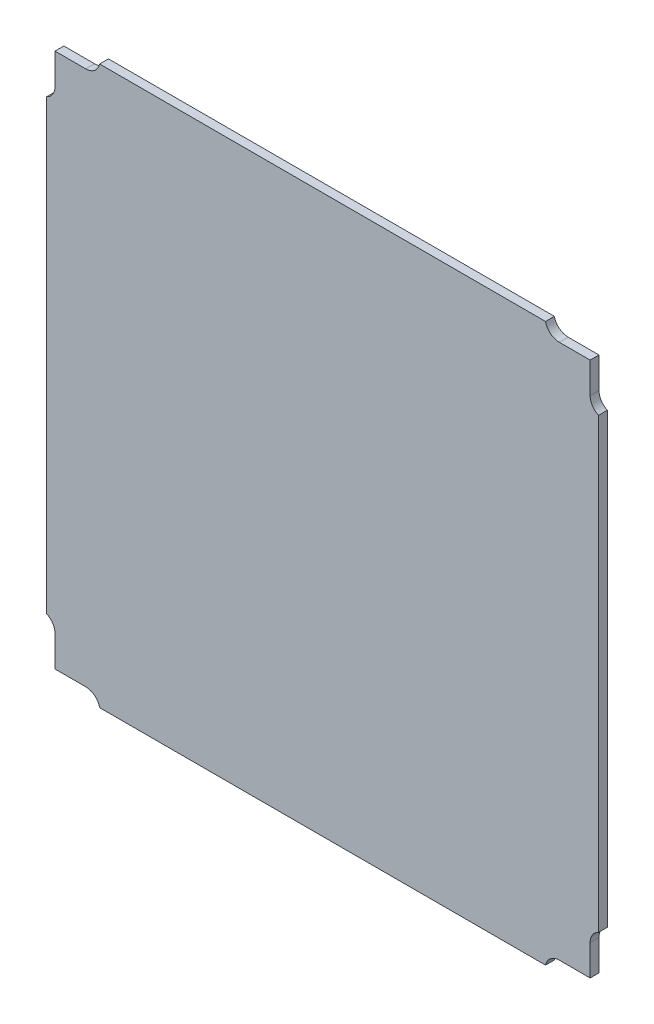
ISO-10303-21;
HEADER;
FILE_DESCRIPTION(('STEP AP214'),'2;1');
FILE_NAME('part.step','',(''),(''),'','','');
FILE_SCHEMA(('AUTOMOTIVE_DESIGN { 1 0 10303 214 1 1 1 1 }'));
ENDSEC;
DATA;
#1=APPLICATION_CONTEXT('core data for automotive mechanical design processes');
#2=APPLICATION_PROTOCOL_DEFINITION('international standard','automotive_design',2000,#1);
#3=PRODUCT_CONTEXT('',#1,'mechanical');
#4=PRODUCT('Part','Part','',(#3));
#5=PRODUCT_RELATED_PRODUCT_CATEGORY('part','',(#4));
#6=PRODUCT_DEFINITION_FORMATION('','',#4);
#7=PRODUCT_DEFINITION_CONTEXT('part definition',#1,'design');
#8=PRODUCT_DEFINITION('design','',#6,#7);
#9=PRODUCT_DEFINITION_SHAPE('','',#8);
#10=(LENGTH_UNIT() NAMED_UNIT(*) SI_UNIT(.MILLI.,.METRE.));
#11=(NAMED_UNIT(*) PLANE_ANGLE_UNIT() SI_UNIT($,.RADIAN.));
#12=(NAMED_UNIT(*) SI_UNIT($,.STERADIAN.) SOLID_ANGLE_UNIT());
#13=UNCERTAINTY_MEASURE_WITH_UNIT(LENGTH_MEASURE(1.E-05),#10,'distance_accuracy_value','');
#14=(GEOMETRIC_REPRESENTATION_CONTEXT(3) GLOBAL_UNCERTAINTY_ASSIGNED_CONTEXT((#13)) GLOBAL_UNIT_ASSIGNED_CONTEXT((#10,
#11,#12)) REPRESENTATION_CONTEXT('',''));
#15=CARTESIAN_POINT('',(0.,0.,0.));
#16=DIRECTION('',(0.,0.,1.));
#17=DIRECTION('',(1.,0.,0.));
#18=AXIS2_PLACEMENT_3D('',#15,#16,#17);
#19=CARTESIAN_POINT('',(0.,0.,1.5875));
#20=DIRECTION('',(0.,0.,1.));
#21=DIRECTION('',(1.,0.,0.));
#22=AXIS2_PLACEMENT_3D('',#19,#20,#21);
#23=PLANE('',#22);
#24=CARTESIAN_POINT('',(-50.54,42.4819347291982,1.5875));
#25=DIRECTION('',(0.,0.,1.));
#26=DIRECTION('',(1.,0.,0.));
#27=AXIS2_PLACEMENT_3D('',#24,#25,#26);
#28=CIRCLE('',#27,2.54);
#29=CARTESIAN_POINT('',(-48.,42.4819347291981,1.5875));
#30=VERTEX_POINT('',#29);
#31=CARTESIAN_POINT('',(-49.5,40.1646086839469,1.5875));
#32=VERTEX_POINT('',#31);
#33=EDGE_CURVE('E207',#30,#32,#28,.F.);
#34=ORIENTED_EDGE('',*,*,#33,.T.);
#35=DIRECTION('',(0.,-1.,0.));
#36=VECTOR('',#35,1.);
#37=CARTESIAN_POINT('',(-49.5,50.,1.5875));
#38=LINE('',#37,#36);
#39=CARTESIAN_POINT('',(-49.5,-40.1646086839469,1.5875));
#40=VERTEX_POINT('',#39);
#41=EDGE_CURVE('E71',#32,#40,#38,.T.);
#42=ORIENTED_EDGE('',*,*,#41,.T.);
#43=CARTESIAN_POINT('',(-50.54,-42.4819347291982,1.5875));
#44=DIRECTION('',(0.,0.,1.));
#45=DIRECTION('',(1.,0.,0.));
#46=AXIS2_PLACEMENT_3D('',#43,#44,#45);
#47=CIRCLE('',#46,2.54);
#48=CARTESIAN_POINT('',(-48.,-42.4819347291982,1.5875));
#49=VERTEX_POINT('',#48);
#50=EDGE_CURVE('E203',#40,#49,#47,.F.);
#51=ORIENTED_EDGE('',*,*,#50,.T.);
#52=DIRECTION('',(0.,-1.,0.));
#53=VECTOR('',#52,1.);
#54=CARTESIAN_POINT('',(-47.9999999999999,0.,1.5875));
#55=LINE('',#54,#53);
#56=CARTESIAN_POINT('',(-48.,-48.,1.5875));
#57=VERTEX_POINT('',#56);
#58=EDGE_CURVE('E301',#49,#57,#55,.T.);
#59=ORIENTED_EDGE('',*,*,#58,.T.);
#60=DIRECTION('',(1.,0.,0.));
#61=VECTOR('',#60,1.);
#62=CARTESIAN_POINT('',(0.,-48.0000000000001,1.5875));
#63=LINE('',#62,#61);
#64=CARTESIAN_POINT('',(-42.4819347291981,-48.,1.5875));
#65=VERTEX_POINT('',#64);
#66=EDGE_CURVE('E312',#57,#65,#63,.T.);
#67=ORIENTED_EDGE('',*,*,#66,.T.);
#68=CARTESIAN_POINT('',(-42.4819347291981,-50.54,1.5875));
#69=DIRECTION('',(0.,0.,1.));
#70=DIRECTION('',(1.,0.,0.));
#71=AXIS2_PLACEMENT_3D('',#68,#69,#70);
#72=CIRCLE('',#71,2.54);
#73=CARTESIAN_POINT('',(-40.,-50.,1.5875));
#74=VERTEX_POINT('',#73);
#75=EDGE_CURVE('E219',#65,#74,#72,.F.);
#76=ORIENTED_EDGE('',*,*,#75,.T.);
#77=DIRECTION('',(1.,0.,0.));
#78=VECTOR('',#77,1.);
#79=CARTESIAN_POINT('',(0.,-50.,1.5875));
#80=LINE('',#79,#78);
#81=CARTESIAN_POINT('',(40.,-50.,1.5875));
#82=VERTEX_POINT('',#81);
#83=EDGE_CURVE('E315',#74,#82,#80,.T.);
#84=ORIENTED_EDGE('',*,*,#83,.T.);
#85=CARTESIAN_POINT('',(42.4819347291982,-50.54,1.5875));
#86=DIRECTION('',(0.,0.,1.));
#87=DIRECTION('',(1.,0.,0.));
#88=AXIS2_PLACEMENT_3D('',#85,#86,#87);
#89=CIRCLE('',#88,2.54);
#90=CARTESIAN_POINT('',(42.4819347291982,-48.,1.5875));
#91=VERTEX_POINT('',#90);
#92=EDGE_CURVE('E229',#82,#91,#89,.F.);
#93=ORIENTED_EDGE('',*,*,#92,.T.);
#94=DIRECTION('',(1.,0.,0.));
#95=VECTOR('',#94,1.);
#96=CARTESIAN_POINT('',(-1.2490009027033E-13,-47.9999999999999,1.5875));
#97=LINE('',#96,#95);
#98=CARTESIAN_POINT('',(48.,-48.,1.5875));
#99=VERTEX_POINT('',#98);
#100=EDGE_CURVE('E319',#91,#99,#97,.T.);
#101=ORIENTED_EDGE('',*,*,#100,.T.);
#102=DIRECTION('',(0.,1.,0.));
#103=VECTOR('',#102,1.);
#104=CARTESIAN_POINT('',(48.0000000000001,0.,1.5875));
#105=LINE('',#104,#103);
#106=CARTESIAN_POINT('',(48.,-42.4819347291982,1.5875));
#107=VERTEX_POINT('',#106);
#108=EDGE_CURVE('E321',#99,#107,#105,.T.);
#109=ORIENTED_EDGE('',*,*,#108,.T.);
#110=CARTESIAN_POINT('',(50.54,-42.4819347291982,1.5875));
#111=DIRECTION('',(0.,0.,1.));
#112=DIRECTION('',(1.,0.,0.));
#113=AXIS2_PLACEMENT_3D('',#110,#111,#112);
#114=CIRCLE('',#113,2.54);
#115=CARTESIAN_POINT('',(49.5,-40.1646086839469,1.5875));
#116=VERTEX_POINT('',#115);
#117=EDGE_CURVE('E233',#107,#116,#114,.F.);
#118=ORIENTED_EDGE('',*,*,#117,.T.);
#119=DIRECTION('',(0.,1.,0.));
#120=VECTOR('',#119,1.);
#121=CARTESIAN_POINT('',(49.5,50.,1.5875));
#122=LINE('',#121,#120);
#123=CARTESIAN_POINT('',(49.5,40.1646086839469,1.5875));
#124=VERTEX_POINT('',#123);
#125=EDGE_CURVE('E208',#116,#124,#122,.T.);
#126=ORIENTED_EDGE('',*,*,#125,.T.);
#127=CARTESIAN_POINT('',(50.54,42.4819347291981,1.5875));
#128=DIRECTION('',(0.,0.,1.));
#129=DIRECTION('',(1.,0.,0.));
#130=AXIS2_PLACEMENT_3D('',#127,#128,#129);
#131=CIRCLE('',#130,2.54);
#132=CARTESIAN_POINT('',(48.,42.4819347291982,1.5875));
#133=VERTEX_POINT('',#132);
#134=EDGE_CURVE('E240',#124,#133,#131,.F.);
#135=ORIENTED_EDGE('',*,*,#134,.T.);
#136=DIRECTION('',(0.,1.,0.));
#137=VECTOR('',#136,1.);
#138=CARTESIAN_POINT('',(47.9999999999999,-1.2490009027033E-13,1.5875));
#139=LINE('',#138,#137);
#140=CARTESIAN_POINT('',(48.,48.,1.5875));
#141=VERTEX_POINT('',#140);
#142=EDGE_CURVE('E323',#133,#141,#139,.T.);
#143=ORIENTED_EDGE('',*,*,#142,.T.);
#144=DIRECTION('',(-1.,0.,0.));
#145=VECTOR('',#144,1.);
#146=CARTESIAN_POINT('',(1.2490009027033E-13,48.0000000000001,1.5875));
#147=LINE('',#146,#145);
#148=CARTESIAN_POINT('',(42.4819347291982,48.,1.5875));
#149=VERTEX_POINT('',#148);
#150=EDGE_CURVE('E326',#141,#149,#147,.T.);
#151=ORIENTED_EDGE('',*,*,#150,.T.);
#152=CARTESIAN_POINT('',(42.4819347291982,50.54,1.5875));
#153=DIRECTION('',(0.,0.,1.));
#154=DIRECTION('',(1.,0.,0.));
#155=AXIS2_PLACEMENT_3D('',#152,#153,#154);
#156=CIRCLE('',#155,2.54);
#157=CARTESIAN_POINT('',(40.,50.,1.5875));
#158=VERTEX_POINT('',#157);
#159=EDGE_CURVE('E246',#149,#158,#156,.F.);
#160=ORIENTED_EDGE('',*,*,#159,.T.);
#161=DIRECTION('',(1.,0.,0.));
#162=VECTOR('',#161,1.);
#163=CARTESIAN_POINT('',(0.,50.,1.5875));
#164=LINE('',#163,#162);
#165=CARTESIAN_POINT('',(-40.,50.,1.5875));
#166=VERTEX_POINT('',#165);
#167=EDGE_CURVE('E330',#166,#158,#164,.T.);
#168=ORIENTED_EDGE('',*,*,#167,.F.);
#169=CARTESIAN_POINT('',(-42.4819347291982,50.54,1.5875));
#170=DIRECTION('',(0.,0.,1.));
#171=DIRECTION('',(1.,0.,0.));
#172=AXIS2_PLACEMENT_3D('',#169,#170,#171);
#173=CIRCLE('',#172,2.54);
#174=CARTESIAN_POINT('',(-42.4819347291982,48.,1.5875));
#175=VERTEX_POINT('',#174);
#176=EDGE_CURVE('E251',#166,#175,#173,.F.);
#177=ORIENTED_EDGE('',*,*,#176,.T.);
#178=DIRECTION('',(-1.,0.,0.));
#179=VECTOR('',#178,1.);
#180=CARTESIAN_POINT('',(0.,47.9999999999999,1.5875));
#181=LINE('',#180,#179);
#182=CARTESIAN_POINT('',(-48.,48.,1.5875));
#183=VERTEX_POINT('',#182);
#184=EDGE_CURVE('E299',#175,#183,#181,.T.);
#185=ORIENTED_EDGE('',*,*,#184,.T.);
#186=DIRECTION('',(0.,-1.,0.));
#187=VECTOR('',#186,1.);
#188=CARTESIAN_POINT('',(-48.0000000000001,0.,1.5875));
#189=LINE('',#188,#187);
#190=EDGE_CURVE('E293',#183,#30,#189,.T.);
#191=ORIENTED_EDGE('',*,*,#190,.T.);
#192=EDGE_LOOP('',(#34,#42,#51,#59,#67,#76,#84,#93,#101,#109,#118,#126,#135,#143,#151,#160,#168,
#177,#185,#191));
#193=FACE_BOUND('',#192,.T.);
#194=ADVANCED_FACE('F44',(#193),#23,.T.);
#195=CARTESIAN_POINT('',(0.,0.,0.));
#196=DIRECTION('',(0.,0.,1.));
#197=DIRECTION('',(1.,0.,0.));
#198=AXIS2_PLACEMENT_3D('',#195,#196,#197);
#199=PLANE('',#198);
#200=CARTESIAN_POINT('',(0.,0.,0.));
#201=DIRECTION('',(0.,0.,1.));
#202=DIRECTION('',(1.,0.,0.));
#203=AXIS2_PLACEMENT_3D('',#200,#201,#202);
#204=CIRCLE('',#203,38.5);
#205=CARTESIAN_POINT('',(38.5,0.,0.));
#206=VERTEX_POINT('',#205);
#207=EDGE_CURVE('E12',#206,#206,#204,.F.);
#208=ORIENTED_EDGE('',*,*,#207,.F.);
#209=EDGE_LOOP('',(#208));
#210=FACE_BOUND('',#209,.T.);
#211=DIRECTION('',(0.,-1.,0.));
#212=VECTOR('',#211,1.);
#213=CARTESIAN_POINT('',(-49.5,50.,0.));
#214=LINE('',#213,#212);
#215=CARTESIAN_POINT('',(-49.5,40.1646086839469,0.));
#216=VERTEX_POINT('',#215);
#217=CARTESIAN_POINT('',(-49.5,-40.1646086839469,0.));
#218=VERTEX_POINT('',#217);
#219=EDGE_CURVE('E195',#216,#218,#214,.T.);
#220=ORIENTED_EDGE('',*,*,#219,.F.);
#221=CARTESIAN_POINT('',(-50.54,42.4819347291982,0.));
#222=DIRECTION('',(0.,0.,1.));
#223=DIRECTION('',(1.,0.,0.));
#224=AXIS2_PLACEMENT_3D('',#221,#222,#223);
#225=CIRCLE('',#224,2.54);
#226=CARTESIAN_POINT('',(-48.,42.4819347291981,0.));
#227=VERTEX_POINT('',#226);
#228=EDGE_CURVE('E253',#216,#227,#225,.T.);
#229=ORIENTED_EDGE('',*,*,#228,.T.);
#230=DIRECTION('',(0.,-1.,0.));
#231=VECTOR('',#230,1.);
#232=CARTESIAN_POINT('',(-48.0000000000001,0.,0.));
#233=LINE('',#232,#231);
#234=CARTESIAN_POINT('',(-48.,48.,0.));
#235=VERTEX_POINT('',#234);
#236=EDGE_CURVE('E295',#235,#227,#233,.T.);
#237=ORIENTED_EDGE('',*,*,#236,.F.);
#238=DIRECTION('',(-1.,0.,0.));
#239=VECTOR('',#238,1.);
#240=CARTESIAN_POINT('',(0.,47.9999999999999,0.));
#241=LINE('',#240,#239);
#242=CARTESIAN_POINT('',(-42.4819347291982,48.,0.));
#243=VERTEX_POINT('',#242);
#244=EDGE_CURVE('E359',#243,#235,#241,.T.);
#245=ORIENTED_EDGE('',*,*,#244,.F.);
#246=CARTESIAN_POINT('',(-42.4819347291982,50.54,0.));
#247=DIRECTION('',(0.,0.,1.));
#248=DIRECTION('',(1.,0.,0.));
#249=AXIS2_PLACEMENT_3D('',#246,#247,#248);
#250=CIRCLE('',#249,2.54);
#251=CARTESIAN_POINT('',(-40.,50.,0.));
#252=VERTEX_POINT('',#251);
#253=EDGE_CURVE('E249',#243,#252,#250,.T.);
#254=ORIENTED_EDGE('',*,*,#253,.T.);
#255=DIRECTION('',(1.,0.,0.));
#256=VECTOR('',#255,1.);
#257=CARTESIAN_POINT('',(0.,50.,0.));
#258=LINE('',#257,#256);
#259=CARTESIAN_POINT('',(40.,50.,0.));
#260=VERTEX_POINT('',#259);
#261=EDGE_CURVE('E355',#252,#260,#258,.T.);
#262=ORIENTED_EDGE('',*,*,#261,.T.);
#263=CARTESIAN_POINT('',(42.4819347291982,50.54,0.));
#264=DIRECTION('',(0.,0.,1.));
#265=DIRECTION('',(1.,0.,0.));
#266=AXIS2_PLACEMENT_3D('',#263,#264,#265);
#267=CIRCLE('',#266,2.54);
#268=CARTESIAN_POINT('',(42.4819347291982,48.,0.));
#269=VERTEX_POINT('',#268);
#270=EDGE_CURVE('E243',#260,#269,#267,.T.);
#271=ORIENTED_EDGE('',*,*,#270,.T.);
#272=DIRECTION('',(-1.,0.,0.));
#273=VECTOR('',#272,1.);
#274=CARTESIAN_POINT('',(1.2490009027033E-13,48.0000000000001,0.));
#275=LINE('',#274,#273);
#276=CARTESIAN_POINT('',(48.,48.,0.));
#277=VERTEX_POINT('',#276);
#278=EDGE_CURVE('E351',#277,#269,#275,.T.);
#279=ORIENTED_EDGE('',*,*,#278,.F.);
#280=DIRECTION('',(0.,1.,0.));
#281=VECTOR('',#280,1.);
#282=CARTESIAN_POINT('',(47.9999999999999,-1.2490009027033E-13,0.));
#283=LINE('',#282,#281);
#284=CARTESIAN_POINT('',(48.,42.4819347291982,0.));
#285=VERTEX_POINT('',#284);
#286=EDGE_CURVE('E348',#285,#277,#283,.T.);
#287=ORIENTED_EDGE('',*,*,#286,.F.);
#288=CARTESIAN_POINT('',(50.54,42.4819347291981,0.));
#289=DIRECTION('',(0.,0.,1.));
#290=DIRECTION('',(1.,0.,0.));
#291=AXIS2_PLACEMENT_3D('',#288,#289,#290);
#292=CIRCLE('',#291,2.54);
#293=CARTESIAN_POINT('',(49.5,40.1646086839469,0.));
#294=VERTEX_POINT('',#293);
#295=EDGE_CURVE('E236',#285,#294,#292,.T.);
#296=ORIENTED_EDGE('',*,*,#295,.T.);
#297=DIRECTION('',(0.,1.,0.));
#298=VECTOR('',#297,1.);
#299=CARTESIAN_POINT('',(49.5,50.,0.));
#300=LINE('',#299,#298);
#301=CARTESIAN_POINT('',(49.5,-40.1646086839469,0.));
#302=VERTEX_POINT('',#301);
#303=EDGE_CURVE('E63',#302,#294,#300,.T.);
#304=ORIENTED_EDGE('',*,*,#303,.F.);
#305=CARTESIAN_POINT('',(50.54,-42.4819347291982,0.));
#306=DIRECTION('',(0.,0.,1.));
#307=DIRECTION('',(1.,0.,0.));
#308=AXIS2_PLACEMENT_3D('',#305,#306,#307);
#309=CIRCLE('',#308,2.54);
#310=CARTESIAN_POINT('',(48.,-42.4819347291982,0.));
#311=VERTEX_POINT('',#310);
#312=EDGE_CURVE('E231',#302,#311,#309,.T.);
#313=ORIENTED_EDGE('',*,*,#312,.T.);
#314=DIRECTION('',(0.,1.,0.));
#315=VECTOR('',#314,1.);
#316=CARTESIAN_POINT('',(48.0000000000001,0.,0.));
#317=LINE('',#316,#315);
#318=CARTESIAN_POINT('',(48.,-48.,0.));
#319=VERTEX_POINT('',#318);
#320=EDGE_CURVE('E345',#319,#311,#317,.T.);
#321=ORIENTED_EDGE('',*,*,#320,.F.);
#322=DIRECTION('',(1.,0.,0.));
#323=VECTOR('',#322,1.);
#324=CARTESIAN_POINT('',(-1.2490009027033E-13,-47.9999999999999,0.));
#325=LINE('',#324,#323);
#326=CARTESIAN_POINT('',(42.4819347291982,-48.,0.));
#327=VERTEX_POINT('',#326);
#328=EDGE_CURVE('E343',#327,#319,#325,.T.);
#329=ORIENTED_EDGE('',*,*,#328,.F.);
#330=CARTESIAN_POINT('',(42.4819347291982,-50.54,0.));
#331=DIRECTION('',(0.,0.,1.));
#332=DIRECTION('',(1.,0.,0.));
#333=AXIS2_PLACEMENT_3D('',#330,#331,#332);
#334=CIRCLE('',#333,2.54);
#335=CARTESIAN_POINT('',(40.,-50.,0.));
#336=VERTEX_POINT('',#335);
#337=EDGE_CURVE('E227',#327,#336,#334,.T.);
#338=ORIENTED_EDGE('',*,*,#337,.T.);
#339=DIRECTION('',(1.,0.,0.));
#340=VECTOR('',#339,1.);
#341=CARTESIAN_POINT('',(0.,-50.,0.));
#342=LINE('',#341,#340);
#343=CARTESIAN_POINT('',(-40.,-50.,0.));
#344=VERTEX_POINT('',#343);
#345=EDGE_CURVE('E339',#344,#336,#342,.T.);
#346=ORIENTED_EDGE('',*,*,#345,.F.);
#347=CARTESIAN_POINT('',(-42.4819347291981,-50.54,0.));
#348=DIRECTION('',(0.,0.,1.));
#349=DIRECTION('',(1.,0.,0.));
#350=AXIS2_PLACEMENT_3D('',#347,#348,#349);
#351=CIRCLE('',#350,2.54);
#352=CARTESIAN_POINT('',(-42.4819347291981,-48.,0.));
#353=VERTEX_POINT('',#352);
#354=EDGE_CURVE('E215',#344,#353,#351,.T.);
#355=ORIENTED_EDGE('',*,*,#354,.T.);
#356=DIRECTION('',(1.,0.,0.));
#357=VECTOR('',#356,1.);
#358=CARTESIAN_POINT('',(0.,-48.0000000000001,0.));
#359=LINE('',#358,#357);
#360=CARTESIAN_POINT('',(-48.,-48.,0.));
#361=VERTEX_POINT('',#360);
#362=EDGE_CURVE('E311',#361,#353,#359,.T.);
#363=ORIENTED_EDGE('',*,*,#362,.F.);
#364=DIRECTION('',(0.,-1.,0.));
#365=VECTOR('',#364,1.);
#366=CARTESIAN_POINT('',(-47.9999999999999,0.,0.));
#367=LINE('',#366,#365);
#368=CARTESIAN_POINT('',(-48.,-42.4819347291982,0.));
#369=VERTEX_POINT('',#368);
#370=EDGE_CURVE('E316',#369,#361,#367,.T.);
#371=ORIENTED_EDGE('',*,*,#370,.F.);
#372=CARTESIAN_POINT('',(-50.54,-42.4819347291982,0.));
#373=DIRECTION('',(0.,0.,1.));
#374=DIRECTION('',(1.,0.,0.));
#375=AXIS2_PLACEMENT_3D('',#372,#373,#374);
#376=CIRCLE('',#375,2.54);
#377=EDGE_CURVE('E216',#369,#218,#376,.T.);
#378=ORIENTED_EDGE('',*,*,#377,.T.);
#379=EDGE_LOOP('',(#220,#229,#237,#245,#254,#262,#271,#279,#287,#296,#304,#313,#321,#329,#338,
#346,#355,#363,#371,#378));
#380=FACE_BOUND('',#379,.T.);
#381=ADVANCED_FACE('F304',(#210,#380),#199,.F.);
#382=CARTESIAN_POINT('',(-50.54,-42.4819347291982,1.5875));
#383=DIRECTION('',(0.,0.,1.));
#384=DIRECTION('',(1.,0.,0.));
#385=AXIS2_PLACEMENT_3D('',#382,#383,#384);
#386=CYLINDRICAL_SURFACE('',#385,2.54);
#387=DIRECTION('',(0.,0.,1.));
#388=VECTOR('',#387,1.);
#389=CARTESIAN_POINT('',(-49.5,-40.1646086839469,1.5875));
#390=LINE('',#389,#388);
#391=EDGE_CURVE('E192',#218,#40,#390,.T.);
#392=ORIENTED_EDGE('',*,*,#391,.F.);
#393=ORIENTED_EDGE('',*,*,#377,.F.);
#394=DIRECTION('',(0.,0.,1.));
#395=VECTOR('',#394,1.);
#396=CARTESIAN_POINT('',(-48.,-42.4819347291982,1.5875));
#397=LINE('',#396,#395);
#398=EDGE_CURVE('E214',#49,#369,#397,.F.);
#399=ORIENTED_EDGE('',*,*,#398,.F.);
#400=ORIENTED_EDGE('',*,*,#50,.F.);
#401=EDGE_LOOP('',(#392,#393,#399,#400));
#402=FACE_BOUND('',#401,.T.);
#403=ADVANCED_FACE('F212',(#402),#386,.F.);
#404=CARTESIAN_POINT('',(50.54,-42.4819347291982,1.5875));
#405=DIRECTION('',(0.,0.,1.));
#406=DIRECTION('',(1.,0.,0.));
#407=AXIS2_PLACEMENT_3D('',#404,#405,#406);
#408=CYLINDRICAL_SURFACE('',#407,2.54);
#409=DIRECTION('',(0.,0.,1.));
#410=VECTOR('',#409,1.);
#411=CARTESIAN_POINT('',(49.5,-40.1646086839469,1.5875));
#412=LINE('',#411,#410);
#413=EDGE_CURVE('E199',#116,#302,#412,.F.);
#414=ORIENTED_EDGE('',*,*,#413,.F.);
#415=ORIENTED_EDGE('',*,*,#117,.F.);
#416=DIRECTION('',(0.,0.,1.));
#417=VECTOR('',#416,1.);
#418=CARTESIAN_POINT('',(48.,-42.4819347291982,1.5875));
#419=LINE('',#418,#417);
#420=EDGE_CURVE('E277',#311,#107,#419,.T.);
#421=ORIENTED_EDGE('',*,*,#420,.F.);
#422=ORIENTED_EDGE('',*,*,#312,.F.);
#423=EDGE_LOOP('',(#414,#415,#421,#422));
#424=FACE_BOUND('',#423,.T.);
#425=ADVANCED_FACE('F407',(#424),#408,.F.);
#426=CARTESIAN_POINT('',(50.54,42.4819347291981,1.5875));
#427=DIRECTION('',(0.,0.,-1.));
#428=DIRECTION('',(-1.,0.,0.));
#429=AXIS2_PLACEMENT_3D('',#426,#427,#428);
#430=CYLINDRICAL_SURFACE('',#429,2.54);
#431=DIRECTION('',(0.,0.,-1.));
#432=VECTOR('',#431,1.);
#433=CARTESIAN_POINT('',(49.5,40.1646086839469,1.5875));
#434=LINE('',#433,#432);
#435=EDGE_CURVE('E53',#294,#124,#434,.F.);
#436=ORIENTED_EDGE('',*,*,#435,.F.);
#437=ORIENTED_EDGE('',*,*,#295,.F.);
#438=DIRECTION('',(0.,0.,-1.));
#439=VECTOR('',#438,1.);
#440=CARTESIAN_POINT('',(48.,42.4819347291982,1.5875));
#441=LINE('',#440,#439);
#442=EDGE_CURVE('E272',#133,#285,#441,.T.);
#443=ORIENTED_EDGE('',*,*,#442,.F.);
#444=ORIENTED_EDGE('',*,*,#134,.F.);
#445=EDGE_LOOP('',(#436,#437,#443,#444));
#446=FACE_BOUND('',#445,.T.);
#447=ADVANCED_FACE('F270',(#446),#430,.F.);
#448=CARTESIAN_POINT('',(-50.54,42.4819347291982,1.5875));
#449=DIRECTION('',(0.,0.,-1.));
#450=DIRECTION('',(-1.,0.,0.));
#451=AXIS2_PLACEMENT_3D('',#448,#449,#450);
#452=CYLINDRICAL_SURFACE('',#451,2.54);
#453=DIRECTION('',(0.,0.,-1.));
#454=VECTOR('',#453,1.);
#455=CARTESIAN_POINT('',(-49.5,40.1646086839469,1.5875));
#456=LINE('',#455,#454);
#457=EDGE_CURVE('E256',#32,#216,#456,.T.);
#458=ORIENTED_EDGE('',*,*,#457,.F.);
#459=ORIENTED_EDGE('',*,*,#33,.F.);
#460=DIRECTION('',(0.,0.,-1.));
#461=VECTOR('',#460,1.);
#462=CARTESIAN_POINT('',(-48.,42.4819347291981,1.5875));
#463=LINE('',#462,#461);
#464=EDGE_CURVE('E221',#227,#30,#463,.F.);
#465=ORIENTED_EDGE('',*,*,#464,.F.);
#466=ORIENTED_EDGE('',*,*,#228,.F.);
#467=EDGE_LOOP('',(#458,#459,#465,#466));
#468=FACE_BOUND('',#467,.T.);
#469=ADVANCED_FACE('F46',(#468),#452,.F.);
#470=CARTESIAN_POINT('',(0.,-48.0000000000001,1.5875));
#471=DIRECTION('',(0.,1.,0.));
#472=DIRECTION('',(-1.,0.,0.));
#473=AXIS2_PLACEMENT_3D('',#470,#471,#472);
#474=PLANE('',#473);
#475=ORIENTED_EDGE('',*,*,#362,.T.);
#476=DIRECTION('',(0.,0.,1.));
#477=VECTOR('',#476,1.);
#478=CARTESIAN_POINT('',(-42.4819347291981,-48.,1.5875));
#479=LINE('',#478,#477);
#480=EDGE_CURVE('E389',#353,#65,#479,.T.);
#481=ORIENTED_EDGE('',*,*,#480,.T.);
#482=ORIENTED_EDGE('',*,*,#66,.F.);
#483=DIRECTION('',(0.,0.,-1.));
#484=VECTOR('',#483,1.);
#485=CARTESIAN_POINT('',(-48.,-48.,1.5875));
#486=LINE('',#485,#484);
#487=EDGE_CURVE('E336',#57,#361,#486,.T.);
#488=ORIENTED_EDGE('',*,*,#487,.T.);
#489=EDGE_LOOP('',(#475,#481,#482,#488));
#490=FACE_BOUND('',#489,.T.);
#491=ADVANCED_FACE('F469',(#490),#474,.F.);
#492=CARTESIAN_POINT('',(0.,-50.,1.5875));
#493=DIRECTION('',(0.,1.,0.));
#494=DIRECTION('',(0.,0.,1.));
#495=AXIS2_PLACEMENT_3D('',#492,#493,#494);
#496=PLANE('',#495);
#497=ORIENTED_EDGE('',*,*,#345,.T.);
#498=DIRECTION('',(0.,0.,-1.));
#499=VECTOR('',#498,1.);
#500=CARTESIAN_POINT('',(40.,-50.,1.5875));
#501=LINE('',#500,#499);
#502=EDGE_CURVE('E381',#82,#336,#501,.T.);
#503=ORIENTED_EDGE('',*,*,#502,.F.);
#504=ORIENTED_EDGE('',*,*,#83,.F.);
#505=DIRECTION('',(0.,0.,-1.));
#506=VECTOR('',#505,1.);
#507=CARTESIAN_POINT('',(-40.,-50.,1.5875));
#508=LINE('',#507,#506);
#509=EDGE_CURVE('E384',#74,#344,#508,.T.);
#510=ORIENTED_EDGE('',*,*,#509,.T.);
#511=EDGE_LOOP('',(#497,#503,#504,#510));
#512=FACE_BOUND('',#511,.T.);
#513=ADVANCED_FACE('F466',(#512),#496,.F.);
#514=CARTESIAN_POINT('',(-1.2490009027033E-13,-47.9999999999999,1.5875));
#515=DIRECTION('',(0.,1.,0.));
#516=DIRECTION('',(-1.,0.,0.));
#517=AXIS2_PLACEMENT_3D('',#514,#515,#516);
#518=PLANE('',#517);
#519=ORIENTED_EDGE('',*,*,#100,.F.);
#520=DIRECTION('',(0.,0.,-1.));
#521=VECTOR('',#520,1.);
#522=CARTESIAN_POINT('',(42.4819347291982,-48.,1.5875));
#523=LINE('',#522,#521);
#524=EDGE_CURVE('E282',#91,#327,#523,.T.);
#525=ORIENTED_EDGE('',*,*,#524,.T.);
#526=ORIENTED_EDGE('',*,*,#328,.T.);
#527=DIRECTION('',(0.,0.,-1.));
#528=VECTOR('',#527,1.);
#529=CARTESIAN_POINT('',(48.,-48.,1.5875));
#530=LINE('',#529,#528);
#531=EDGE_CURVE('E378',#99,#319,#530,.T.);
#532=ORIENTED_EDGE('',*,*,#531,.F.);
#533=EDGE_LOOP('',(#519,#525,#526,#532));
#534=FACE_BOUND('',#533,.T.);
#535=ADVANCED_FACE('F395',(#534),#518,.F.);
#536=CARTESIAN_POINT('',(48.0000000000001,0.,1.5875));
#537=DIRECTION('',(-1.,0.,0.));
#538=DIRECTION('',(0.,-1.,0.));
#539=AXIS2_PLACEMENT_3D('',#536,#537,#538);
#540=PLANE('',#539);
#541=ORIENTED_EDGE('',*,*,#320,.T.);
#542=ORIENTED_EDGE('',*,*,#420,.T.);
#543=ORIENTED_EDGE('',*,*,#108,.F.);
#544=ORIENTED_EDGE('',*,*,#531,.T.);
#545=EDGE_LOOP('',(#541,#542,#543,#544));
#546=FACE_BOUND('',#545,.T.);
#547=ADVANCED_FACE('F404',(#546),#540,.F.);
#548=CARTESIAN_POINT('',(47.9999999999999,-1.2490009027033E-13,1.5875));
#549=DIRECTION('',(-1.,0.,0.));
#550=DIRECTION('',(0.,-1.,0.));
#551=AXIS2_PLACEMENT_3D('',#548,#549,#550);
#552=PLANE('',#551);
#553=ORIENTED_EDGE('',*,*,#142,.F.);
#554=ORIENTED_EDGE('',*,*,#442,.T.);
#555=ORIENTED_EDGE('',*,*,#286,.T.);
#556=DIRECTION('',(0.,0.,-1.));
#557=VECTOR('',#556,1.);
#558=CARTESIAN_POINT('',(48.,48.,1.5875));
#559=LINE('',#558,#557);
#560=EDGE_CURVE('E374',#141,#277,#559,.T.);
#561=ORIENTED_EDGE('',*,*,#560,.F.);
#562=EDGE_LOOP('',(#553,#554,#555,#561));
#563=FACE_BOUND('',#562,.T.);
#564=ADVANCED_FACE('F410',(#563),#552,.F.);
#565=CARTESIAN_POINT('',(1.2490009027033E-13,48.0000000000001,1.5875));
#566=DIRECTION('',(0.,-1.,0.));
#567=DIRECTION('',(1.,0.,0.));
#568=AXIS2_PLACEMENT_3D('',#565,#566,#567);
#569=PLANE('',#568);
#570=ORIENTED_EDGE('',*,*,#278,.T.);
#571=DIRECTION('',(0.,0.,-1.));
#572=VECTOR('',#571,1.);
#573=CARTESIAN_POINT('',(42.4819347291982,48.,1.5875));
#574=LINE('',#573,#572);
#575=EDGE_CURVE('E276',#269,#149,#574,.F.);
#576=ORIENTED_EDGE('',*,*,#575,.T.);
#577=ORIENTED_EDGE('',*,*,#150,.F.);
#578=ORIENTED_EDGE('',*,*,#560,.T.);
#579=EDGE_LOOP('',(#570,#576,#577,#578));
#580=FACE_BOUND('',#579,.T.);
#581=ADVANCED_FACE('F413',(#580),#569,.F.);
#582=CARTESIAN_POINT('',(0.,50.,1.5875));
#583=DIRECTION('',(0.,1.,0.));
#584=DIRECTION('',(0.,0.,1.));
#585=AXIS2_PLACEMENT_3D('',#582,#583,#584);
#586=PLANE('',#585);
#587=ORIENTED_EDGE('',*,*,#261,.F.);
#588=DIRECTION('',(0.,0.,-1.));
#589=VECTOR('',#588,1.);
#590=CARTESIAN_POINT('',(-40.,50.,1.5875));
#591=LINE('',#590,#589);
#592=EDGE_CURVE('E367',#166,#252,#591,.T.);
#593=ORIENTED_EDGE('',*,*,#592,.F.);
#594=ORIENTED_EDGE('',*,*,#167,.T.);
#595=DIRECTION('',(0.,0.,-1.));
#596=VECTOR('',#595,1.);
#597=CARTESIAN_POINT('',(40.,50.,1.5875));
#598=LINE('',#597,#596);
#599=EDGE_CURVE('E370',#158,#260,#598,.T.);
#600=ORIENTED_EDGE('',*,*,#599,.T.);
#601=EDGE_LOOP('',(#587,#593,#594,#600));
#602=FACE_BOUND('',#601,.T.);
#603=ADVANCED_FACE('F422',(#602),#586,.T.);
#604=CARTESIAN_POINT('',(0.,47.9999999999999,1.5875));
#605=DIRECTION('',(0.,-1.,0.));
#606=DIRECTION('',(1.,0.,0.));
#607=AXIS2_PLACEMENT_3D('',#604,#605,#606);
#608=PLANE('',#607);
#609=ORIENTED_EDGE('',*,*,#184,.F.);
#610=DIRECTION('',(0.,0.,1.));
#611=VECTOR('',#610,1.);
#612=CARTESIAN_POINT('',(-42.4819347291982,48.,1.5875));
#613=LINE('',#612,#611);
#614=EDGE_CURVE('E280',#175,#243,#613,.F.);
#615=ORIENTED_EDGE('',*,*,#614,.T.);
#616=ORIENTED_EDGE('',*,*,#244,.T.);
#617=DIRECTION('',(0.,0.,-1.));
#618=VECTOR('',#617,1.);
#619=CARTESIAN_POINT('',(-48.,48.,1.5875));
#620=LINE('',#619,#618);
#621=EDGE_CURVE('E365',#183,#235,#620,.T.);
#622=ORIENTED_EDGE('',*,*,#621,.F.);
#623=EDGE_LOOP('',(#609,#615,#616,#622));
#624=FACE_BOUND('',#623,.T.);
#625=ADVANCED_FACE('F429',(#624),#608,.F.);
#626=CARTESIAN_POINT('',(-48.0000000000001,0.,1.5875));
#627=DIRECTION('',(1.,0.,0.));
#628=DIRECTION('',(0.,1.,0.));
#629=AXIS2_PLACEMENT_3D('',#626,#627,#628);
#630=PLANE('',#629);
#631=ORIENTED_EDGE('',*,*,#236,.T.);
#632=ORIENTED_EDGE('',*,*,#464,.T.);
#633=ORIENTED_EDGE('',*,*,#190,.F.);
#634=ORIENTED_EDGE('',*,*,#621,.T.);
#635=EDGE_LOOP('',(#631,#632,#633,#634));
#636=FACE_BOUND('',#635,.T.);
#637=ADVANCED_FACE('F291',(#636),#630,.F.);
#638=CARTESIAN_POINT('',(-47.9999999999999,0.,1.5875));
#639=DIRECTION('',(1.,0.,0.));
#640=DIRECTION('',(0.,1.,0.));
#641=AXIS2_PLACEMENT_3D('',#638,#639,#640);
#642=PLANE('',#641);
#643=ORIENTED_EDGE('',*,*,#58,.F.);
#644=ORIENTED_EDGE('',*,*,#398,.T.);
#645=ORIENTED_EDGE('',*,*,#370,.T.);
#646=ORIENTED_EDGE('',*,*,#487,.F.);
#647=EDGE_LOOP('',(#643,#644,#645,#646));
#648=FACE_BOUND('',#647,.T.);
#649=ADVANCED_FACE('F436',(#648),#642,.F.);
#650=CARTESIAN_POINT('',(-42.4819347291981,-50.54,1.5875));
#651=DIRECTION('',(0.,0.,1.));
#652=DIRECTION('',(1.,0.,0.));
#653=AXIS2_PLACEMENT_3D('',#650,#651,#652);
#654=CYLINDRICAL_SURFACE('',#653,2.54);
#655=ORIENTED_EDGE('',*,*,#75,.F.);
#656=ORIENTED_EDGE('',*,*,#480,.F.);
#657=ORIENTED_EDGE('',*,*,#354,.F.);
#658=ORIENTED_EDGE('',*,*,#509,.F.);
#659=EDGE_LOOP('',(#655,#656,#657,#658));
#660=FACE_BOUND('',#659,.T.);
#661=ADVANCED_FACE('F450',(#660),#654,.F.);
#662=CARTESIAN_POINT('',(42.4819347291982,-50.54,1.5875));
#663=DIRECTION('',(0.,0.,-1.));
#664=DIRECTION('',(-1.,0.,0.));
#665=AXIS2_PLACEMENT_3D('',#662,#663,#664);
#666=CYLINDRICAL_SURFACE('',#665,2.54);
#667=ORIENTED_EDGE('',*,*,#92,.F.);
#668=ORIENTED_EDGE('',*,*,#502,.T.);
#669=ORIENTED_EDGE('',*,*,#337,.F.);
#670=ORIENTED_EDGE('',*,*,#524,.F.);
#671=EDGE_LOOP('',(#667,#668,#669,#670));
#672=FACE_BOUND('',#671,.T.);
#673=ADVANCED_FACE('F455',(#672),#666,.F.);
#674=CARTESIAN_POINT('',(42.4819347291982,50.54,1.5875));
#675=DIRECTION('',(0.,0.,-1.));
#676=DIRECTION('',(-1.,0.,0.));
#677=AXIS2_PLACEMENT_3D('',#674,#675,#676);
#678=CYLINDRICAL_SURFACE('',#677,2.54);
#679=ORIENTED_EDGE('',*,*,#159,.F.);
#680=ORIENTED_EDGE('',*,*,#575,.F.);
#681=ORIENTED_EDGE('',*,*,#270,.F.);
#682=ORIENTED_EDGE('',*,*,#599,.F.);
#683=EDGE_LOOP('',(#679,#680,#681,#682));
#684=FACE_BOUND('',#683,.T.);
#685=ADVANCED_FACE('F419',(#684),#678,.F.);
#686=CARTESIAN_POINT('',(-42.4819347291982,50.54,1.5875));
#687=DIRECTION('',(0.,0.,1.));
#688=DIRECTION('',(1.,0.,0.));
#689=AXIS2_PLACEMENT_3D('',#686,#687,#688);
#690=CYLINDRICAL_SURFACE('',#689,2.54);
#691=ORIENTED_EDGE('',*,*,#176,.F.);
#692=ORIENTED_EDGE('',*,*,#592,.T.);
#693=ORIENTED_EDGE('',*,*,#253,.F.);
#694=ORIENTED_EDGE('',*,*,#614,.F.);
#695=EDGE_LOOP('',(#691,#692,#693,#694));
#696=FACE_BOUND('',#695,.T.);
#697=ADVANCED_FACE('F427',(#696),#690,.F.);
#698=CARTESIAN_POINT('',(-49.5,50.,0.));
#699=DIRECTION('',(-1.,0.,0.));
#700=DIRECTION('',(0.,-1.,0.));
#701=AXIS2_PLACEMENT_3D('',#698,#699,#700);
#702=PLANE('',#701);
#703=ORIENTED_EDGE('',*,*,#391,.T.);
#704=ORIENTED_EDGE('',*,*,#41,.F.);
#705=ORIENTED_EDGE('',*,*,#457,.T.);
#706=ORIENTED_EDGE('',*,*,#219,.T.);
#707=EDGE_LOOP('',(#703,#704,#705,#706));
#708=FACE_BOUND('',#707,.T.);
#709=ADVANCED_FACE('F193',(#708),#702,.T.);
#710=CARTESIAN_POINT('',(49.5,50.,0.));
#711=DIRECTION('',(1.,0.,0.));
#712=DIRECTION('',(0.,1.,0.));
#713=AXIS2_PLACEMENT_3D('',#710,#711,#712);
#714=PLANE('',#713);
#715=ORIENTED_EDGE('',*,*,#413,.T.);
#716=ORIENTED_EDGE('',*,*,#303,.T.);
#717=ORIENTED_EDGE('',*,*,#435,.T.);
#718=ORIENTED_EDGE('',*,*,#125,.F.);
#719=EDGE_LOOP('',(#715,#716,#717,#718));
#720=FACE_BOUND('',#719,.T.);
#721=ADVANCED_FACE('F261',(#720),#714,.T.);
#722=CARTESIAN_POINT('',(0.,0.,-0.1));
#723=DIRECTION('',(0.,0.,1.));
#724=DIRECTION('',(1.,0.,0.));
#725=AXIS2_PLACEMENT_3D('',#722,#723,#724);
#726=CYLINDRICAL_SURFACE('',#725,38.5);
#727=CARTESIAN_POINT('',(0.,0.,-0.1));
#728=DIRECTION('',(0.,0.,-1.));
#729=DIRECTION('',(-1.,0.,0.));
#730=AXIS2_PLACEMENT_3D('',#727,#728,#729);
#731=CIRCLE('',#730,38.5);
#732=CARTESIAN_POINT('',(-38.5,0.,-0.1));
#733=VERTEX_POINT('',#732);
#734=EDGE_CURVE('E209',#733,#733,#731,.T.);
#735=ORIENTED_EDGE('',*,*,#734,.F.);
#736=EDGE_LOOP('',(#735));
#737=FACE_BOUND('',#736,.T.);
#738=ORIENTED_EDGE('',*,*,#207,.T.);
#739=EDGE_LOOP('',(#738));
#740=FACE_BOUND('',#739,.T.);
#741=ADVANCED_FACE('F495',(#737,#740),#726,.T.);
#742=CARTESIAN_POINT('',(0.,0.,-0.1));
#743=DIRECTION('',(0.,0.,-1.));
#744=DIRECTION('',(-1.,0.,0.));
#745=AXIS2_PLACEMENT_3D('',#742,#743,#744);
#746=PLANE('',#745);
#747=ORIENTED_EDGE('',*,*,#734,.T.);
#748=EDGE_LOOP('',(#747));
#749=FACE_BOUND('',#748,.T.);
#750=ADVANCED_FACE('F499',(#749),#746,.T.);
#751=CLOSED_SHELL('',(#194,#381,#403,#425,#447,#469,#491,#513,#535,#547,#564,#581,#603,#625,
#637,#649,#661,#673,#685,#697,#709,#721,#741,#750));
#752=MANIFOLD_SOLID_BREP('B2',#751);
#753=ADVANCED_BREP_SHAPE_REPRESENTATION('',(#18,#752),#14);
#754=SHAPE_DEFINITION_REPRESENTATION(#9,#753);
ENDSEC;
END-ISO-10303-21;
